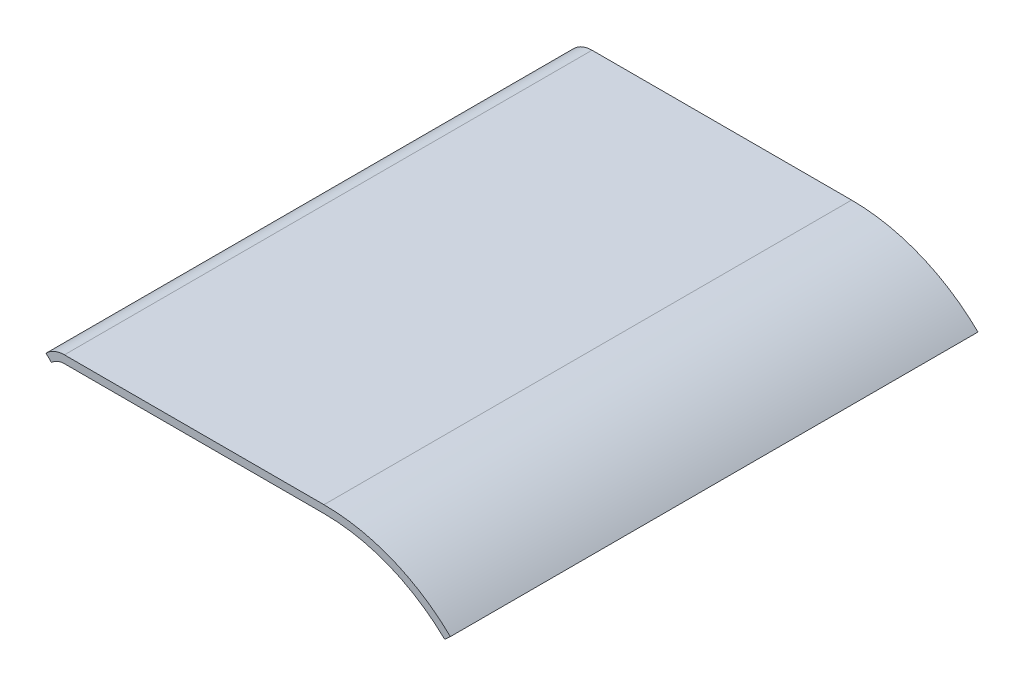
ISO-10303-21;
HEADER;
FILE_DESCRIPTION(('STEP AP214'),'2;1');
FILE_NAME('part.step','',(''),(''),'','','');
FILE_SCHEMA(('AUTOMOTIVE_DESIGN { 1 0 10303 214 1 1 1 1 }'));
ENDSEC;
DATA;
#1=APPLICATION_CONTEXT('core data for automotive mechanical design processes');
#2=APPLICATION_PROTOCOL_DEFINITION('international standard','automotive_design',2000,#1);
#3=PRODUCT_CONTEXT('',#1,'mechanical');
#4=PRODUCT('Part','Part','',(#3));
#5=PRODUCT_RELATED_PRODUCT_CATEGORY('part','',(#4));
#6=PRODUCT_DEFINITION_FORMATION('','',#4);
#7=PRODUCT_DEFINITION_CONTEXT('part definition',#1,'design');
#8=PRODUCT_DEFINITION('design','',#6,#7);
#9=PRODUCT_DEFINITION_SHAPE('','',#8);
#10=(LENGTH_UNIT() NAMED_UNIT(*) SI_UNIT(.MILLI.,.METRE.));
#11=(NAMED_UNIT(*) PLANE_ANGLE_UNIT() SI_UNIT($,.RADIAN.));
#12=(NAMED_UNIT(*) SI_UNIT($,.STERADIAN.) SOLID_ANGLE_UNIT());
#13=UNCERTAINTY_MEASURE_WITH_UNIT(LENGTH_MEASURE(1.E-05),#10,'distance_accuracy_value','');
#14=(GEOMETRIC_REPRESENTATION_CONTEXT(3) GLOBAL_UNCERTAINTY_ASSIGNED_CONTEXT((#13)) GLOBAL_UNIT_ASSIGNED_CONTEXT((#10,
#11,#12)) REPRESENTATION_CONTEXT('',''));
#15=CARTESIAN_POINT('',(0.,0.,0.));
#16=DIRECTION('',(0.,0.,1.));
#17=DIRECTION('',(1.,0.,0.));
#18=AXIS2_PLACEMENT_3D('',#15,#16,#17);
#19=CARTESIAN_POINT('',(0.,-10.,206.));
#20=DIRECTION('',(0.,0.,-1.));
#21=DIRECTION('',(-1.,0.,0.));
#22=AXIS2_PLACEMENT_3D('',#19,#20,#21);
#23=CYLINDRICAL_SURFACE('',#22,10.);
#24=CARTESIAN_POINT('',(0.,-10.,0.));
#25=DIRECTION('',(0.,0.,1.));
#26=DIRECTION('',(1.,0.,0.));
#27=AXIS2_PLACEMENT_3D('',#24,#25,#26);
#28=CIRCLE('',#27,10.);
#29=CARTESIAN_POINT('',(0.,0.,0.));
#30=VERTEX_POINT('',#29);
#31=CARTESIAN_POINT('',(-7.19339800338648,-3.05341629540999,0.));
#32=VERTEX_POINT('',#31);
#33=EDGE_CURVE('E148',#30,#32,#28,.T.);
#34=ORIENTED_EDGE('',*,*,#33,.T.);
#35=DIRECTION('',(0.,0.,-1.));
#36=VECTOR('',#35,1.);
#37=CARTESIAN_POINT('',(-7.19339800338648,-3.05341629540999,206.));
#38=LINE('',#37,#36);
#39=CARTESIAN_POINT('',(-7.19339800338648,-3.05341629540999,206.));
#40=VERTEX_POINT('',#39);
#41=EDGE_CURVE('E11',#40,#32,#38,.T.);
#42=ORIENTED_EDGE('',*,*,#41,.F.);
#43=CARTESIAN_POINT('',(0.,-10.,206.));
#44=DIRECTION('',(0.,0.,1.));
#45=DIRECTION('',(1.,0.,0.));
#46=AXIS2_PLACEMENT_3D('',#43,#44,#45);
#47=CIRCLE('',#46,10.);
#48=CARTESIAN_POINT('',(0.,0.,206.));
#49=VERTEX_POINT('',#48);
#50=EDGE_CURVE('E169',#49,#40,#47,.T.);
#51=ORIENTED_EDGE('',*,*,#50,.F.);
#52=DIRECTION('',(0.,0.,-1.));
#53=VECTOR('',#52,1.);
#54=CARTESIAN_POINT('',(0.,0.,206.));
#55=LINE('',#54,#53);
#56=EDGE_CURVE('E142',#49,#30,#55,.T.);
#57=ORIENTED_EDGE('',*,*,#56,.T.);
#58=EDGE_LOOP('',(#34,#42,#51,#57));
#59=FACE_BOUND('',#58,.T.);
#60=ADVANCED_FACE('F44',(#59),#23,.T.);
#61=CARTESIAN_POINT('',(-7.19339800338648,-3.05341629540999,206.));
#62=DIRECTION('',(0.694658370459001,0.719339800338648,0.));
#63=DIRECTION('',(-0.719339800338648,0.694658370459001,0.));
#64=AXIS2_PLACEMENT_3D('',#61,#62,#63);
#65=PLANE('',#64);
#66=DIRECTION('',(0.719339800338648,-0.694658370459001,0.));
#67=VECTOR('',#66,1.);
#68=CARTESIAN_POINT('',(-7.19339800338648,-3.05341629540999,0.));
#69=LINE('',#68,#67);
#70=CARTESIAN_POINT('',(-5.03537860237053,-5.13739140678699,0.));
#71=VERTEX_POINT('',#70);
#72=EDGE_CURVE('E147',#32,#71,#69,.T.);
#73=ORIENTED_EDGE('',*,*,#72,.T.);
#74=DIRECTION('',(0.,0.,-1.));
#75=VECTOR('',#74,1.);
#76=CARTESIAN_POINT('',(-5.03537860237053,-5.13739140678699,206.));
#77=LINE('',#76,#75);
#78=CARTESIAN_POINT('',(-5.03537860237053,-5.13739140678699,206.));
#79=VERTEX_POINT('',#78);
#80=EDGE_CURVE('E53',#79,#71,#77,.T.);
#81=ORIENTED_EDGE('',*,*,#80,.F.);
#82=DIRECTION('',(0.719339800338648,-0.694658370459001,0.));
#83=VECTOR('',#82,1.);
#84=CARTESIAN_POINT('',(-7.19339800338648,-3.05341629540999,206.));
#85=LINE('',#84,#83);
#86=EDGE_CURVE('E104',#40,#79,#85,.T.);
#87=ORIENTED_EDGE('',*,*,#86,.F.);
#88=ORIENTED_EDGE('',*,*,#41,.T.);
#89=EDGE_LOOP('',(#73,#81,#87,#88));
#90=FACE_BOUND('',#89,.T.);
#91=ADVANCED_FACE('F212',(#90),#65,.F.);
#92=CARTESIAN_POINT('',(0.,-10.,206.));
#93=DIRECTION('',(0.,0.,-1.));
#94=DIRECTION('',(-1.,0.,0.));
#95=AXIS2_PLACEMENT_3D('',#92,#93,#94);
#96=CYLINDRICAL_SURFACE('',#95,7.);
#97=CARTESIAN_POINT('',(0.,-10.,0.));
#98=DIRECTION('',(0.,0.,-1.));
#99=DIRECTION('',(1.,0.,0.));
#100=AXIS2_PLACEMENT_3D('',#97,#98,#99);
#101=CIRCLE('',#100,7.);
#102=CARTESIAN_POINT('',(0.,-3.,0.));
#103=VERTEX_POINT('',#102);
#104=EDGE_CURVE('E153',#71,#103,#101,.T.);
#105=ORIENTED_EDGE('',*,*,#104,.T.);
#106=DIRECTION('',(0.,0.,-1.));
#107=VECTOR('',#106,1.);
#108=CARTESIAN_POINT('',(0.,-3.,206.));
#109=LINE('',#108,#107);
#110=CARTESIAN_POINT('',(0.,-3.,206.));
#111=VERTEX_POINT('',#110);
#112=EDGE_CURVE('E178',#111,#103,#109,.T.);
#113=ORIENTED_EDGE('',*,*,#112,.F.);
#114=CARTESIAN_POINT('',(0.,-10.,206.));
#115=DIRECTION('',(0.,0.,-1.));
#116=DIRECTION('',(1.,0.,0.));
#117=AXIS2_PLACEMENT_3D('',#114,#115,#116);
#118=CIRCLE('',#117,7.);
#119=EDGE_CURVE('E186',#79,#111,#118,.T.);
#120=ORIENTED_EDGE('',*,*,#119,.F.);
#121=ORIENTED_EDGE('',*,*,#80,.T.);
#122=EDGE_LOOP('',(#105,#113,#120,#121));
#123=FACE_BOUND('',#122,.T.);
#124=ADVANCED_FACE('F190',(#123),#96,.F.);
#125=CARTESIAN_POINT('',(0.,-3.,206.));
#126=DIRECTION('',(0.,1.,0.));
#127=DIRECTION('',(0.,0.,1.));
#128=AXIS2_PLACEMENT_3D('',#125,#126,#127);
#129=PLANE('',#128);
#130=DIRECTION('',(1.,0.,0.));
#131=VECTOR('',#130,1.);
#132=CARTESIAN_POINT('',(0.,-3.,0.));
#133=LINE('',#132,#131);
#134=CARTESIAN_POINT('',(101.34,-2.99999999999978,0.));
#135=VERTEX_POINT('',#134);
#136=EDGE_CURVE('E156',#103,#135,#133,.T.);
#137=ORIENTED_EDGE('',*,*,#136,.T.);
#138=DIRECTION('',(0.,0.,-1.));
#139=VECTOR('',#138,1.);
#140=CARTESIAN_POINT('',(101.34,-2.99999999999978,206.));
#141=LINE('',#140,#139);
#142=CARTESIAN_POINT('',(101.34,-2.99999999999978,206.));
#143=VERTEX_POINT('',#142);
#144=EDGE_CURVE('E173',#143,#135,#141,.T.);
#145=ORIENTED_EDGE('',*,*,#144,.F.);
#146=DIRECTION('',(1.,0.,0.));
#147=VECTOR('',#146,1.);
#148=CARTESIAN_POINT('',(0.,-3.,206.));
#149=LINE('',#148,#147);
#150=EDGE_CURVE('E205',#111,#143,#149,.T.);
#151=ORIENTED_EDGE('',*,*,#150,.F.);
#152=ORIENTED_EDGE('',*,*,#112,.T.);
#153=EDGE_LOOP('',(#137,#145,#151,#152));
#154=FACE_BOUND('',#153,.T.);
#155=ADVANCED_FACE('F197',(#154),#129,.F.);
#156=CARTESIAN_POINT('',(101.34,-71.04,206.));
#157=DIRECTION('',(0.,0.,-1.));
#158=DIRECTION('',(-1.,0.,0.));
#159=AXIS2_PLACEMENT_3D('',#156,#157,#158);
#160=CYLINDRICAL_SURFACE('',#159,68.0400000000002);
#161=CARTESIAN_POINT('',(101.34,-71.04,0.));
#162=DIRECTION('',(0.,0.,-1.));
#163=DIRECTION('',(-1.,0.,0.));
#164=AXIS2_PLACEMENT_3D('',#161,#162,#163);
#165=CIRCLE('',#164,68.0400000000002);
#166=CARTESIAN_POINT('',(148.453411139185,-21.9506112196313,0.));
#167=VERTEX_POINT('',#166);
#168=EDGE_CURVE('E157',#135,#167,#165,.T.);
#169=ORIENTED_EDGE('',*,*,#168,.T.);
#170=DIRECTION('',(0.,0.,-1.));
#171=VECTOR('',#170,1.);
#172=CARTESIAN_POINT('',(148.453411139185,-21.9506112196313,206.));
#173=LINE('',#172,#171);
#174=CARTESIAN_POINT('',(148.453411139185,-21.9506112196313,206.));
#175=VERTEX_POINT('',#174);
#176=EDGE_CURVE('E133',#175,#167,#173,.T.);
#177=ORIENTED_EDGE('',*,*,#176,.F.);
#178=CARTESIAN_POINT('',(101.34,-71.04,206.));
#179=DIRECTION('',(0.,0.,-1.));
#180=DIRECTION('',(-1.,0.,0.));
#181=AXIS2_PLACEMENT_3D('',#178,#179,#180);
#182=CIRCLE('',#181,68.0400000000002);
#183=EDGE_CURVE('E123',#143,#175,#182,.T.);
#184=ORIENTED_EDGE('',*,*,#183,.F.);
#185=ORIENTED_EDGE('',*,*,#144,.T.);
#186=EDGE_LOOP('',(#169,#177,#184,#185));
#187=FACE_BOUND('',#186,.T.);
#188=ADVANCED_FACE('F199',(#187),#160,.F.);
#189=CARTESIAN_POINT('',(150.688530637407,-19.9381005839425,206.));
#190=DIRECTION('',(-0.669130606358907,0.743144825477351,0.));
#191=DIRECTION('',(-0.743144825477351,-0.669130606358907,0.));
#192=AXIS2_PLACEMENT_3D('',#189,#190,#191);
#193=PLANE('',#192);
#194=DIRECTION('',(0.743144825477351,0.669130606358906,0.));
#195=VECTOR('',#194,1.);
#196=CARTESIAN_POINT('',(150.688530637407,-19.9381005839425,0.));
#197=LINE('',#196,#195);
#198=CARTESIAN_POINT('',(150.688530637407,-19.9381005839425,0.));
#199=VERTEX_POINT('',#198);
#200=EDGE_CURVE('E134',#167,#199,#197,.T.);
#201=ORIENTED_EDGE('',*,*,#200,.T.);
#202=DIRECTION('',(0.,0.,-1.));
#203=VECTOR('',#202,1.);
#204=CARTESIAN_POINT('',(150.688530637407,-19.9381005839425,206.));
#205=LINE('',#204,#203);
#206=CARTESIAN_POINT('',(150.688530637407,-19.9381005839425,206.));
#207=VERTEX_POINT('',#206);
#208=EDGE_CURVE('E128',#207,#199,#205,.T.);
#209=ORIENTED_EDGE('',*,*,#208,.F.);
#210=DIRECTION('',(0.743144825477351,0.669130606358906,0.));
#211=VECTOR('',#210,1.);
#212=CARTESIAN_POINT('',(150.688530637407,-19.9381005839425,206.));
#213=LINE('',#212,#211);
#214=EDGE_CURVE('E119',#175,#207,#213,.T.);
#215=ORIENTED_EDGE('',*,*,#214,.F.);
#216=ORIENTED_EDGE('',*,*,#176,.T.);
#217=EDGE_LOOP('',(#201,#209,#215,#216));
#218=FACE_BOUND('',#217,.T.);
#219=ADVANCED_FACE('F132',(#218),#193,.F.);
#220=CARTESIAN_POINT('',(101.34,-71.04,206.));
#221=DIRECTION('',(0.,0.,-1.));
#222=DIRECTION('',(-1.,0.,0.));
#223=AXIS2_PLACEMENT_3D('',#220,#221,#222);
#224=CYLINDRICAL_SURFACE('',#223,71.04);
#225=CARTESIAN_POINT('',(101.34,-71.04,0.));
#226=DIRECTION('',(0.,0.,1.));
#227=DIRECTION('',(-1.,0.,0.));
#228=AXIS2_PLACEMENT_3D('',#225,#226,#227);
#229=CIRCLE('',#228,71.04);
#230=CARTESIAN_POINT('',(101.34,0.,0.));
#231=VERTEX_POINT('',#230);
#232=EDGE_CURVE('E93',#199,#231,#229,.T.);
#233=ORIENTED_EDGE('',*,*,#232,.T.);
#234=DIRECTION('',(0.,0.,-1.));
#235=VECTOR('',#234,1.);
#236=CARTESIAN_POINT('',(101.34,0.,206.));
#237=LINE('',#236,#235);
#238=CARTESIAN_POINT('',(101.34,0.,206.));
#239=VERTEX_POINT('',#238);
#240=EDGE_CURVE('E136',#239,#231,#237,.T.);
#241=ORIENTED_EDGE('',*,*,#240,.F.);
#242=CARTESIAN_POINT('',(101.34,-71.04,206.));
#243=DIRECTION('',(0.,0.,1.));
#244=DIRECTION('',(-1.,0.,0.));
#245=AXIS2_PLACEMENT_3D('',#242,#243,#244);
#246=CIRCLE('',#245,71.04);
#247=EDGE_CURVE('E125',#207,#239,#246,.T.);
#248=ORIENTED_EDGE('',*,*,#247,.F.);
#249=ORIENTED_EDGE('',*,*,#208,.T.);
#250=EDGE_LOOP('',(#233,#241,#248,#249));
#251=FACE_BOUND('',#250,.T.);
#252=ADVANCED_FACE('F137',(#251),#224,.T.);
#253=CARTESIAN_POINT('',(0.,0.,206.));
#254=DIRECTION('',(0.,-1.,0.));
#255=DIRECTION('',(0.,0.,-1.));
#256=AXIS2_PLACEMENT_3D('',#253,#254,#255);
#257=PLANE('',#256);
#258=DIRECTION('',(-1.,0.,0.));
#259=VECTOR('',#258,1.);
#260=CARTESIAN_POINT('',(0.,0.,0.));
#261=LINE('',#260,#259);
#262=EDGE_CURVE('E100',#231,#30,#261,.T.);
#263=ORIENTED_EDGE('',*,*,#262,.T.);
#264=ORIENTED_EDGE('',*,*,#56,.F.);
#265=DIRECTION('',(-1.,0.,0.));
#266=VECTOR('',#265,1.);
#267=CARTESIAN_POINT('',(0.,0.,206.));
#268=LINE('',#267,#266);
#269=EDGE_CURVE('E65',#239,#49,#268,.T.);
#270=ORIENTED_EDGE('',*,*,#269,.F.);
#271=ORIENTED_EDGE('',*,*,#240,.T.);
#272=EDGE_LOOP('',(#263,#264,#270,#271));
#273=FACE_BOUND('',#272,.T.);
#274=ADVANCED_FACE('F228',(#273),#257,.F.);
#275=CARTESIAN_POINT('',(0.,-10.,206.));
#276=DIRECTION('',(0.,0.,1.));
#277=DIRECTION('',(1.,0.,0.));
#278=AXIS2_PLACEMENT_3D('',#275,#276,#277);
#279=PLANE('',#278);
#280=ORIENTED_EDGE('',*,*,#50,.T.);
#281=ORIENTED_EDGE('',*,*,#86,.T.);
#282=ORIENTED_EDGE('',*,*,#119,.T.);
#283=ORIENTED_EDGE('',*,*,#150,.T.);
#284=ORIENTED_EDGE('',*,*,#183,.T.);
#285=ORIENTED_EDGE('',*,*,#214,.T.);
#286=ORIENTED_EDGE('',*,*,#247,.T.);
#287=ORIENTED_EDGE('',*,*,#269,.T.);
#288=EDGE_LOOP('',(#280,#281,#282,#283,#284,#285,#286,#287));
#289=FACE_BOUND('',#288,.T.);
#290=ADVANCED_FACE('F118',(#289),#279,.T.);
#291=CARTESIAN_POINT('',(0.,-10.,0.));
#292=DIRECTION('',(0.,0.,1.));
#293=DIRECTION('',(1.,0.,0.));
#294=AXIS2_PLACEMENT_3D('',#291,#292,#293);
#295=PLANE('',#294);
#296=ORIENTED_EDGE('',*,*,#33,.F.);
#297=ORIENTED_EDGE('',*,*,#262,.F.);
#298=ORIENTED_EDGE('',*,*,#232,.F.);
#299=ORIENTED_EDGE('',*,*,#200,.F.);
#300=ORIENTED_EDGE('',*,*,#168,.F.);
#301=ORIENTED_EDGE('',*,*,#136,.F.);
#302=ORIENTED_EDGE('',*,*,#104,.F.);
#303=ORIENTED_EDGE('',*,*,#72,.F.);
#304=EDGE_LOOP('',(#296,#297,#298,#299,#300,#301,#302,#303));
#305=FACE_BOUND('',#304,.T.);
#306=ADVANCED_FACE('F192',(#305),#295,.F.);
#307=CLOSED_SHELL('',(#60,#91,#124,#155,#188,#219,#252,#274,#290,#306));
#308=MANIFOLD_SOLID_BREP('B2',#307);
#309=ADVANCED_BREP_SHAPE_REPRESENTATION('',(#18,#308),#14);
#310=SHAPE_DEFINITION_REPRESENTATION(#9,#309);
ENDSEC;
END-ISO-10303-21;
